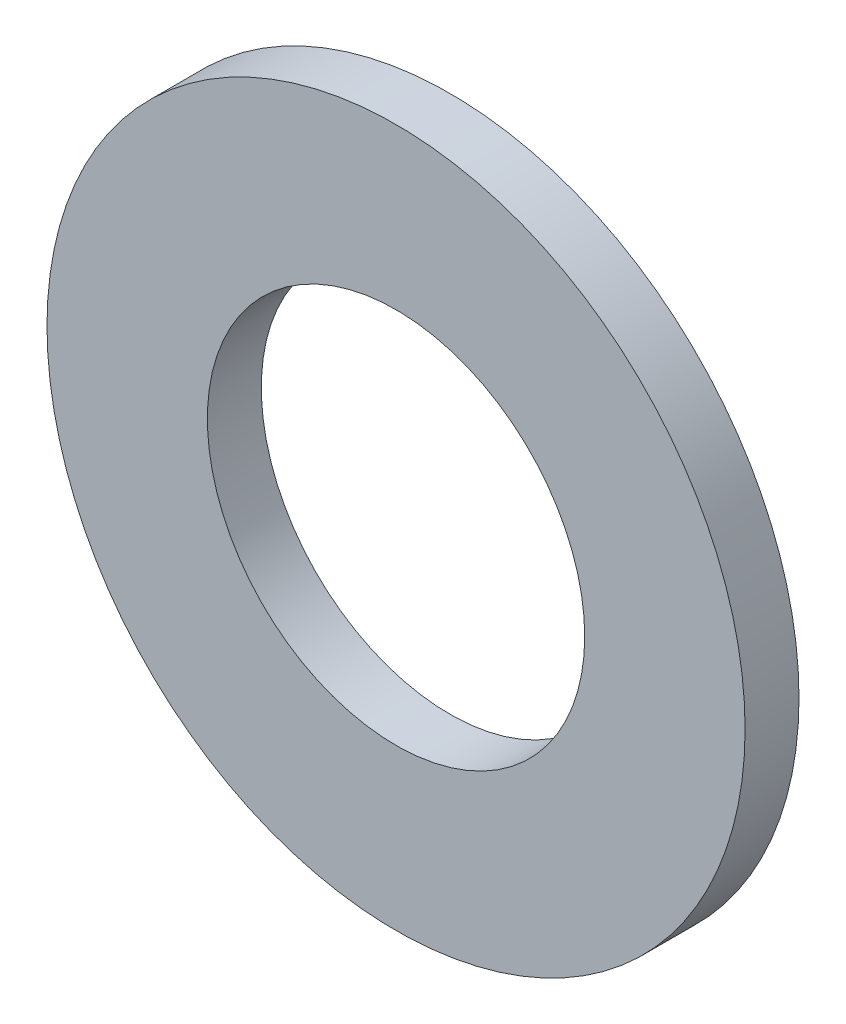
ISO-10303-21;
HEADER;
FILE_DESCRIPTION(('STEP AP214'),'2;1');
FILE_NAME('part.step','',(''),(''),'','','');
FILE_SCHEMA(('AUTOMOTIVE_DESIGN { 1 0 10303 214 1 1 1 1 }'));
ENDSEC;
DATA;
#1=APPLICATION_CONTEXT('core data for automotive mechanical design processes');
#2=APPLICATION_PROTOCOL_DEFINITION('international standard','automotive_design',2000,#1);
#3=PRODUCT_CONTEXT('',#1,'mechanical');
#4=PRODUCT('Part','Part','',(#3));
#5=PRODUCT_RELATED_PRODUCT_CATEGORY('part','',(#4));
#6=PRODUCT_DEFINITION_FORMATION('','',#4);
#7=PRODUCT_DEFINITION_CONTEXT('part definition',#1,'design');
#8=PRODUCT_DEFINITION('design','',#6,#7);
#9=PRODUCT_DEFINITION_SHAPE('','',#8);
#10=(LENGTH_UNIT() NAMED_UNIT(*) SI_UNIT(.MILLI.,.METRE.));
#11=(NAMED_UNIT(*) PLANE_ANGLE_UNIT() SI_UNIT($,.RADIAN.));
#12=(NAMED_UNIT(*) SI_UNIT($,.STERADIAN.) SOLID_ANGLE_UNIT());
#13=UNCERTAINTY_MEASURE_WITH_UNIT(LENGTH_MEASURE(1.E-05),#10,'distance_accuracy_value','');
#14=(GEOMETRIC_REPRESENTATION_CONTEXT(3) GLOBAL_UNCERTAINTY_ASSIGNED_CONTEXT((#13)) GLOBAL_UNIT_ASSIGNED_CONTEXT((#10,
#11,#12)) REPRESENTATION_CONTEXT('',''));
#15=CARTESIAN_POINT('',(0.,0.,0.));
#16=DIRECTION('',(0.,0.,1.));
#17=DIRECTION('',(1.,0.,0.));
#18=AXIS2_PLACEMENT_3D('',#15,#16,#17);
#19=CARTESIAN_POINT('',(0.,0.,2.));
#20=DIRECTION('',(0.,0.,1.));
#21=DIRECTION('',(1.,0.,0.));
#22=AXIS2_PLACEMENT_3D('',#19,#20,#21);
#23=PLANE('',#22);
#24=CARTESIAN_POINT('',(0.,0.,2.));
#25=DIRECTION('',(0.,0.,1.));
#26=DIRECTION('',(1.,0.,0.));
#27=AXIS2_PLACEMENT_3D('',#24,#25,#26);
#28=CIRCLE('',#27,12.95);
#29=CARTESIAN_POINT('',(12.95,0.,2.));
#30=VERTEX_POINT('',#29);
#31=EDGE_CURVE('E10',#30,#30,#28,.T.);
#32=ORIENTED_EDGE('',*,*,#31,.T.);
#33=EDGE_LOOP('',(#32));
#34=FACE_BOUND('',#33,.T.);
#35=CARTESIAN_POINT('',(0.,0.,2.));
#36=DIRECTION('',(0.,0.,1.));
#37=DIRECTION('',(1.,0.,0.));
#38=AXIS2_PLACEMENT_3D('',#35,#36,#37);
#39=CIRCLE('',#38,7.);
#40=CARTESIAN_POINT('',(7.,0.,2.));
#41=VERTEX_POINT('',#40);
#42=EDGE_CURVE('E50',#41,#41,#39,.T.);
#43=ORIENTED_EDGE('',*,*,#42,.F.);
#44=EDGE_LOOP('',(#43));
#45=FACE_BOUND('',#44,.T.);
#46=ADVANCED_FACE('F37',(#34,#45),#23,.T.);
#47=CARTESIAN_POINT('',(0.,0.,0.));
#48=DIRECTION('',(0.,0.,1.));
#49=DIRECTION('',(1.,0.,0.));
#50=AXIS2_PLACEMENT_3D('',#47,#48,#49);
#51=PLANE('',#50);
#52=CARTESIAN_POINT('',(0.,0.,0.));
#53=DIRECTION('',(0.,0.,1.));
#54=DIRECTION('',(1.,0.,0.));
#55=AXIS2_PLACEMENT_3D('',#52,#53,#54);
#56=CIRCLE('',#55,12.95);
#57=CARTESIAN_POINT('',(12.95,0.,0.));
#58=VERTEX_POINT('',#57);
#59=EDGE_CURVE('E41',#58,#58,#56,.T.);
#60=ORIENTED_EDGE('',*,*,#59,.F.);
#61=EDGE_LOOP('',(#60));
#62=FACE_BOUND('',#61,.T.);
#63=CARTESIAN_POINT('',(0.,0.,0.));
#64=DIRECTION('',(0.,0.,1.));
#65=DIRECTION('',(1.,0.,0.));
#66=AXIS2_PLACEMENT_3D('',#63,#64,#65);
#67=CIRCLE('',#66,7.);
#68=CARTESIAN_POINT('',(7.,0.,0.));
#69=VERTEX_POINT('',#68);
#70=EDGE_CURVE('E52',#69,#69,#67,.T.);
#71=ORIENTED_EDGE('',*,*,#70,.T.);
#72=EDGE_LOOP('',(#71));
#73=FACE_BOUND('',#72,.T.);
#74=ADVANCED_FACE('F64',(#62,#73),#51,.F.);
#75=CARTESIAN_POINT('',(0.,0.,2.));
#76=DIRECTION('',(0.,0.,-1.));
#77=DIRECTION('',(-1.,0.,0.));
#78=AXIS2_PLACEMENT_3D('',#75,#76,#77);
#79=CYLINDRICAL_SURFACE('',#78,12.95);
#80=ORIENTED_EDGE('',*,*,#31,.F.);
#81=EDGE_LOOP('',(#80));
#82=FACE_BOUND('',#81,.T.);
#83=ORIENTED_EDGE('',*,*,#59,.T.);
#84=EDGE_LOOP('',(#83));
#85=FACE_BOUND('',#84,.T.);
#86=ADVANCED_FACE('F39',(#82,#85),#79,.T.);
#87=CARTESIAN_POINT('',(0.,0.,2.));
#88=DIRECTION('',(0.,0.,-1.));
#89=DIRECTION('',(-1.,0.,0.));
#90=AXIS2_PLACEMENT_3D('',#87,#88,#89);
#91=CYLINDRICAL_SURFACE('',#90,7.);
#92=ORIENTED_EDGE('',*,*,#42,.T.);
#93=EDGE_LOOP('',(#92));
#94=FACE_BOUND('',#93,.T.);
#95=ORIENTED_EDGE('',*,*,#70,.F.);
#96=EDGE_LOOP('',(#95));
#97=FACE_BOUND('',#96,.T.);
#98=ADVANCED_FACE('F60',(#94,#97),#91,.F.);
#99=CLOSED_SHELL('',(#46,#74,#86,#98));
#100=MANIFOLD_SOLID_BREP('B2',#99);
#101=ADVANCED_BREP_SHAPE_REPRESENTATION('',(#18,#100),#14);
#102=SHAPE_DEFINITION_REPRESENTATION(#9,#101);
ENDSEC;
END-ISO-10303-21;
